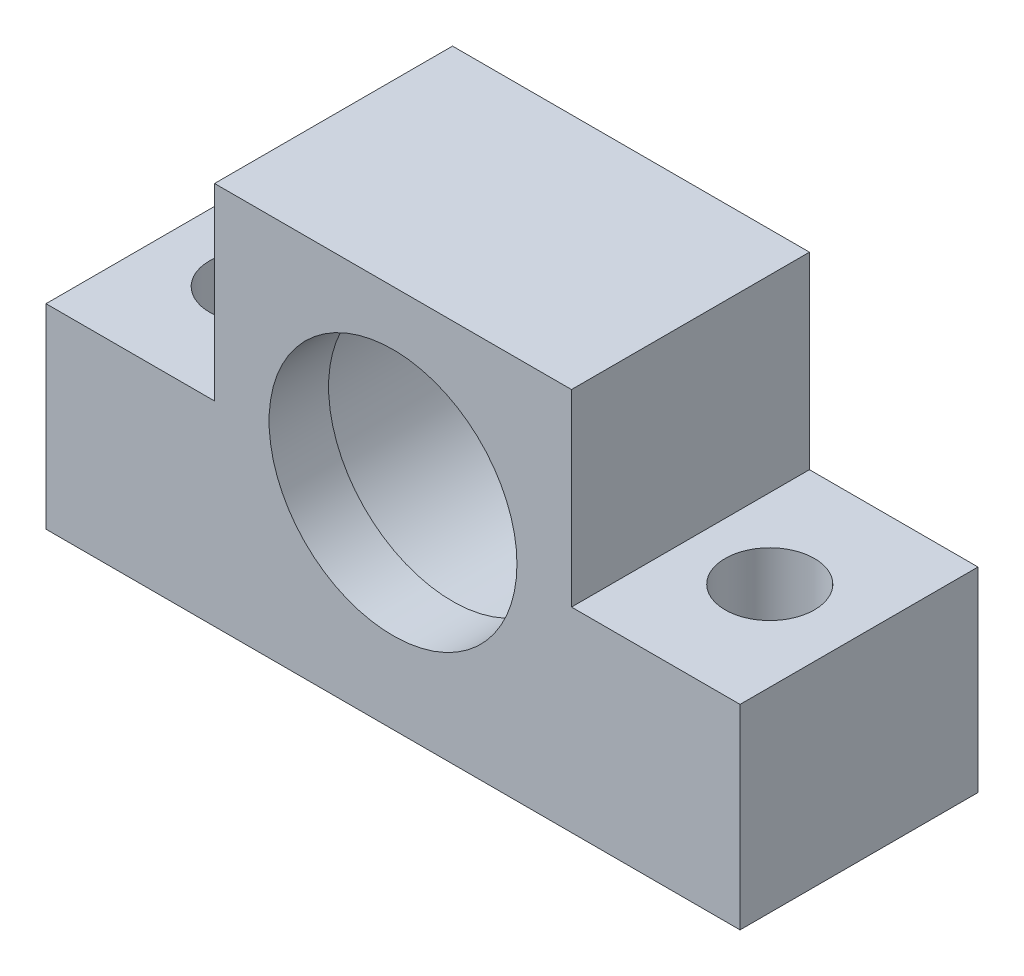
ISO-10303-21;
HEADER;
FILE_DESCRIPTION(('STEP AP214'),'2;1');
FILE_NAME('part.step','',(''),(''),'','','');
FILE_SCHEMA(('AUTOMOTIVE_DESIGN { 1 0 10303 214 1 1 1 1 }'));
ENDSEC;
DATA;
#1=APPLICATION_CONTEXT('core data for automotive mechanical design processes');
#2=APPLICATION_PROTOCOL_DEFINITION('international standard','automotive_design',2000,#1);
#3=PRODUCT_CONTEXT('',#1,'mechanical');
#4=PRODUCT('Part','Part','',(#3));
#5=PRODUCT_RELATED_PRODUCT_CATEGORY('part','',(#4));
#6=PRODUCT_DEFINITION_FORMATION('','',#4);
#7=PRODUCT_DEFINITION_CONTEXT('part definition',#1,'design');
#8=PRODUCT_DEFINITION('design','',#6,#7);
#9=PRODUCT_DEFINITION_SHAPE('','',#8);
#10=(LENGTH_UNIT() NAMED_UNIT(*) SI_UNIT(.MILLI.,.METRE.));
#11=(NAMED_UNIT(*) PLANE_ANGLE_UNIT() SI_UNIT($,.RADIAN.));
#12=(NAMED_UNIT(*) SI_UNIT($,.STERADIAN.) SOLID_ANGLE_UNIT());
#13=UNCERTAINTY_MEASURE_WITH_UNIT(LENGTH_MEASURE(1.E-05),#10,'distance_accuracy_value','');
#14=(GEOMETRIC_REPRESENTATION_CONTEXT(3) GLOBAL_UNCERTAINTY_ASSIGNED_CONTEXT((#13)) GLOBAL_UNIT_ASSIGNED_CONTEXT((#10,
#11,#12)) REPRESENTATION_CONTEXT('',''));
#15=CARTESIAN_POINT('',(0.,0.,0.));
#16=DIRECTION('',(0.,0.,1.));
#17=DIRECTION('',(1.,0.,0.));
#18=AXIS2_PLACEMENT_3D('',#15,#16,#17);
#19=CARTESIAN_POINT('',(0.,0.,0.));
#20=DIRECTION('',(0.,0.,-1.));
#21=DIRECTION('',(-1.,0.,0.));
#22=AXIS2_PLACEMENT_3D('',#19,#20,#21);
#23=PLANE('',#22);
#24=CARTESIAN_POINT('',(-14.1421356237309,34.842135623731,0.));
#25=DIRECTION('',(0.,0.,-1.));
#26=DIRECTION('',(-1.,0.,0.));
#27=AXIS2_PLACEMENT_3D('',#24,#25,#26);
#28=CIRCLE('',#27,1.25);
#29=CARTESIAN_POINT('',(-15.3921356237309,34.842135623731,0.));
#30=VERTEX_POINT('',#29);
#31=EDGE_CURVE('E132',#30,#30,#28,.T.);
#32=ORIENTED_EDGE('',*,*,#31,.F.);
#33=EDGE_LOOP('',(#32));
#34=FACE_BOUND('',#33,.T.);
#35=CARTESIAN_POINT('',(-14.1421356237313,6.55786437626902,0.));
#36=DIRECTION('',(0.,0.,-1.));
#37=DIRECTION('',(-1.,0.,0.));
#38=AXIS2_PLACEMENT_3D('',#35,#36,#37);
#39=CIRCLE('',#38,1.25);
#40=CARTESIAN_POINT('',(-15.3921356237313,6.55786437626902,0.));
#41=VERTEX_POINT('',#40);
#42=EDGE_CURVE('E131',#41,#41,#39,.T.);
#43=ORIENTED_EDGE('',*,*,#42,.F.);
#44=EDGE_LOOP('',(#43));
#45=FACE_BOUND('',#44,.T.);
#46=CARTESIAN_POINT('',(14.1421356237306,6.55786437626872,0.));
#47=DIRECTION('',(0.,0.,-1.));
#48=DIRECTION('',(-1.,0.,0.));
#49=AXIS2_PLACEMENT_3D('',#46,#47,#48);
#50=CIRCLE('',#49,1.25);
#51=CARTESIAN_POINT('',(12.8921356237306,6.55786437626872,0.));
#52=VERTEX_POINT('',#51);
#53=EDGE_CURVE('E142',#52,#52,#50,.T.);
#54=ORIENTED_EDGE('',*,*,#53,.F.);
#55=EDGE_LOOP('',(#54));
#56=FACE_BOUND('',#55,.T.);
#57=CARTESIAN_POINT('',(14.1421356237308,34.8421356237307,0.));
#58=DIRECTION('',(0.,0.,-1.));
#59=DIRECTION('',(-1.,0.,0.));
#60=AXIS2_PLACEMENT_3D('',#57,#58,#59);
#61=CIRCLE('',#60,1.25);
#62=CARTESIAN_POINT('',(12.8921356237308,34.8421356237307,0.));
#63=VERTEX_POINT('',#62);
#64=EDGE_CURVE('E148',#63,#63,#61,.T.);
#65=ORIENTED_EDGE('',*,*,#64,.F.);
#66=EDGE_LOOP('',(#65));
#67=FACE_BOUND('',#66,.T.);
#68=DIRECTION('',(-1.,0.,0.));
#69=VECTOR('',#68,1.);
#70=CARTESIAN_POINT('',(35.,19.7,0.));
#71=LINE('',#70,#69);
#72=CARTESIAN_POINT('',(35.,19.7,0.));
#73=VERTEX_POINT('',#72);
#74=CARTESIAN_POINT('',(18.,19.7,0.));
#75=VERTEX_POINT('',#74);
#76=EDGE_CURVE('E202',#73,#75,#71,.T.);
#77=ORIENTED_EDGE('',*,*,#76,.F.);
#78=DIRECTION('',(0.,1.,0.));
#79=VECTOR('',#78,1.);
#80=CARTESIAN_POINT('',(35.,0.,0.));
#81=LINE('',#80,#79);
#82=CARTESIAN_POINT('',(35.,0.,0.));
#83=VERTEX_POINT('',#82);
#84=EDGE_CURVE('E60',#83,#73,#81,.T.);
#85=ORIENTED_EDGE('',*,*,#84,.F.);
#86=DIRECTION('',(1.,0.,0.));
#87=VECTOR('',#86,1.);
#88=CARTESIAN_POINT('',(-35.,0.,0.));
#89=LINE('',#88,#87);
#90=CARTESIAN_POINT('',(-35.,0.,0.));
#91=VERTEX_POINT('',#90);
#92=EDGE_CURVE('E68',#91,#83,#89,.T.);
#93=ORIENTED_EDGE('',*,*,#92,.F.);
#94=DIRECTION('',(0.,-1.,0.));
#95=VECTOR('',#94,1.);
#96=CARTESIAN_POINT('',(-35.,19.7,0.));
#97=LINE('',#96,#95);
#98=CARTESIAN_POINT('',(-35.,19.7,0.));
#99=VERTEX_POINT('',#98);
#100=EDGE_CURVE('E213',#99,#91,#97,.T.);
#101=ORIENTED_EDGE('',*,*,#100,.F.);
#102=DIRECTION('',(-1.,0.,0.));
#103=VECTOR('',#102,1.);
#104=CARTESIAN_POINT('',(-18.,19.7,0.));
#105=LINE('',#104,#103);
#106=CARTESIAN_POINT('',(-18.,19.7,0.));
#107=VERTEX_POINT('',#106);
#108=EDGE_CURVE('E211',#107,#99,#105,.T.);
#109=ORIENTED_EDGE('',*,*,#108,.F.);
#110=DIRECTION('',(0.,-1.,0.));
#111=VECTOR('',#110,1.);
#112=CARTESIAN_POINT('',(-18.,38.7,0.));
#113=LINE('',#112,#111);
#114=CARTESIAN_POINT('',(-18.,38.7,0.));
#115=VERTEX_POINT('',#114);
#116=EDGE_CURVE('E209',#115,#107,#113,.T.);
#117=ORIENTED_EDGE('',*,*,#116,.F.);
#118=DIRECTION('',(-1.,0.,0.));
#119=VECTOR('',#118,1.);
#120=CARTESIAN_POINT('',(18.,38.7,0.));
#121=LINE('',#120,#119);
#122=CARTESIAN_POINT('',(18.,38.7,0.));
#123=VERTEX_POINT('',#122);
#124=EDGE_CURVE('E207',#123,#115,#121,.T.);
#125=ORIENTED_EDGE('',*,*,#124,.F.);
#126=DIRECTION('',(0.,1.,0.));
#127=VECTOR('',#126,1.);
#128=CARTESIAN_POINT('',(18.,19.7,0.));
#129=LINE('',#128,#127);
#130=EDGE_CURVE('E205',#75,#123,#129,.T.);
#131=ORIENTED_EDGE('',*,*,#130,.F.);
#132=EDGE_LOOP('',(#77,#85,#93,#101,#109,#117,#125,#131));
#133=FACE_BOUND('',#132,.T.);
#134=CARTESIAN_POINT('',(0.,20.7,0.));
#135=DIRECTION('',(0.,0.,1.));
#136=DIRECTION('',(1.,0.,0.));
#137=AXIS2_PLACEMENT_3D('',#134,#135,#136);
#138=CIRCLE('',#137,14.);
#139=CARTESIAN_POINT('',(14.,20.7,0.));
#140=VERTEX_POINT('',#139);
#141=EDGE_CURVE('E199',#140,#140,#138,.T.);
#142=ORIENTED_EDGE('',*,*,#141,.T.);
#143=EDGE_LOOP('',(#142));
#144=FACE_BOUND('',#143,.T.);
#145=ADVANCED_FACE('F45',(#34,#45,#56,#67,#133,#144),#23,.T.);
#146=CARTESIAN_POINT('',(35.,19.7,18.));
#147=DIRECTION('',(0.,-1.,0.));
#148=DIRECTION('',(1.,0.,0.));
#149=AXIS2_PLACEMENT_3D('',#146,#147,#148);
#150=PLANE('',#149);
#151=CARTESIAN_POINT('',(26.,19.7,12.));
#152=DIRECTION('',(0.,1.,0.));
#153=DIRECTION('',(1.,0.,0.));
#154=AXIS2_PLACEMENT_3D('',#151,#152,#153);
#155=CIRCLE('',#154,4.5);
#156=CARTESIAN_POINT('',(30.5,19.7,12.));
#157=VERTEX_POINT('',#156);
#158=EDGE_CURVE('E162',#157,#157,#155,.T.);
#159=ORIENTED_EDGE('',*,*,#158,.F.);
#160=EDGE_LOOP('',(#159));
#161=FACE_BOUND('',#160,.T.);
#162=ORIENTED_EDGE('',*,*,#76,.T.);
#163=DIRECTION('',(0.,0.,-1.));
#164=VECTOR('',#163,1.);
#165=CARTESIAN_POINT('',(18.,19.7,18.));
#166=LINE('',#165,#164);
#167=CARTESIAN_POINT('',(18.,19.7,24.));
#168=VERTEX_POINT('',#167);
#169=EDGE_CURVE('E11',#168,#75,#166,.T.);
#170=ORIENTED_EDGE('',*,*,#169,.F.);
#171=DIRECTION('',(-1.,0.,0.));
#172=VECTOR('',#171,1.);
#173=CARTESIAN_POINT('',(0.,19.7,24.));
#174=LINE('',#173,#172);
#175=CARTESIAN_POINT('',(35.,19.7,24.));
#176=VERTEX_POINT('',#175);
#177=EDGE_CURVE('E170',#176,#168,#174,.T.);
#178=ORIENTED_EDGE('',*,*,#177,.F.);
#179=DIRECTION('',(0.,0.,-1.));
#180=VECTOR('',#179,1.);
#181=CARTESIAN_POINT('',(35.,19.7,18.));
#182=LINE('',#181,#180);
#183=EDGE_CURVE('E217',#176,#73,#182,.T.);
#184=ORIENTED_EDGE('',*,*,#183,.T.);
#185=EDGE_LOOP('',(#162,#170,#178,#184));
#186=FACE_BOUND('',#185,.T.);
#187=ADVANCED_FACE('F47',(#161,#186),#150,.F.);
#188=CARTESIAN_POINT('',(18.,19.7,18.));
#189=DIRECTION('',(-1.,0.,0.));
#190=DIRECTION('',(0.,-1.,0.));
#191=AXIS2_PLACEMENT_3D('',#188,#189,#190);
#192=PLANE('',#191);
#193=ORIENTED_EDGE('',*,*,#130,.T.);
#194=DIRECTION('',(0.,0.,-1.));
#195=VECTOR('',#194,1.);
#196=CARTESIAN_POINT('',(18.,38.7,18.));
#197=LINE('',#196,#195);
#198=CARTESIAN_POINT('',(18.,38.7,24.));
#199=VERTEX_POINT('',#198);
#200=EDGE_CURVE('E53',#199,#123,#197,.T.);
#201=ORIENTED_EDGE('',*,*,#200,.F.);
#202=DIRECTION('',(0.,1.,0.));
#203=VECTOR('',#202,1.);
#204=CARTESIAN_POINT('',(18.,0.,24.));
#205=LINE('',#204,#203);
#206=EDGE_CURVE('E173',#168,#199,#205,.T.);
#207=ORIENTED_EDGE('',*,*,#206,.F.);
#208=ORIENTED_EDGE('',*,*,#169,.T.);
#209=EDGE_LOOP('',(#193,#201,#207,#208));
#210=FACE_BOUND('',#209,.T.);
#211=ADVANCED_FACE('F262',(#210),#192,.F.);
#212=CARTESIAN_POINT('',(18.,38.7,18.));
#213=DIRECTION('',(0.,-1.,0.));
#214=DIRECTION('',(0.,0.,-1.));
#215=AXIS2_PLACEMENT_3D('',#212,#213,#214);
#216=PLANE('',#215);
#217=ORIENTED_EDGE('',*,*,#124,.T.);
#218=DIRECTION('',(0.,0.,-1.));
#219=VECTOR('',#218,1.);
#220=CARTESIAN_POINT('',(-18.,38.7,18.));
#221=LINE('',#220,#219);
#222=CARTESIAN_POINT('',(-18.,38.7,24.));
#223=VERTEX_POINT('',#222);
#224=EDGE_CURVE('E229',#223,#115,#221,.T.);
#225=ORIENTED_EDGE('',*,*,#224,.F.);
#226=DIRECTION('',(-1.,0.,0.));
#227=VECTOR('',#226,1.);
#228=CARTESIAN_POINT('',(0.,38.7,24.));
#229=LINE('',#228,#227);
#230=EDGE_CURVE('E176',#199,#223,#229,.T.);
#231=ORIENTED_EDGE('',*,*,#230,.F.);
#232=ORIENTED_EDGE('',*,*,#200,.T.);
#233=EDGE_LOOP('',(#217,#225,#231,#232));
#234=FACE_BOUND('',#233,.T.);
#235=ADVANCED_FACE('F235',(#234),#216,.F.);
#236=CARTESIAN_POINT('',(-18.,38.7,18.));
#237=DIRECTION('',(1.,0.,0.));
#238=DIRECTION('',(0.,1.,0.));
#239=AXIS2_PLACEMENT_3D('',#236,#237,#238);
#240=PLANE('',#239);
#241=ORIENTED_EDGE('',*,*,#116,.T.);
#242=DIRECTION('',(0.,0.,-1.));
#243=VECTOR('',#242,1.);
#244=CARTESIAN_POINT('',(-18.,19.7,18.));
#245=LINE('',#244,#243);
#246=CARTESIAN_POINT('',(-18.,19.7,24.));
#247=VERTEX_POINT('',#246);
#248=EDGE_CURVE('E226',#247,#107,#245,.T.);
#249=ORIENTED_EDGE('',*,*,#248,.F.);
#250=DIRECTION('',(0.,-1.,0.));
#251=VECTOR('',#250,1.);
#252=CARTESIAN_POINT('',(-18.,0.,24.));
#253=LINE('',#252,#251);
#254=EDGE_CURVE('E179',#223,#247,#253,.T.);
#255=ORIENTED_EDGE('',*,*,#254,.F.);
#256=ORIENTED_EDGE('',*,*,#224,.T.);
#257=EDGE_LOOP('',(#241,#249,#255,#256));
#258=FACE_BOUND('',#257,.T.);
#259=ADVANCED_FACE('F245',(#258),#240,.F.);
#260=CARTESIAN_POINT('',(-18.,19.7,18.));
#261=DIRECTION('',(0.,-1.,0.));
#262=DIRECTION('',(1.,0.,0.));
#263=AXIS2_PLACEMENT_3D('',#260,#261,#262);
#264=PLANE('',#263);
#265=CARTESIAN_POINT('',(-26.,19.7,12.));
#266=DIRECTION('',(0.,1.,0.));
#267=DIRECTION('',(-1.,0.,0.));
#268=AXIS2_PLACEMENT_3D('',#265,#266,#267);
#269=CIRCLE('',#268,4.5);
#270=CARTESIAN_POINT('',(-30.5,19.7,12.));
#271=VERTEX_POINT('',#270);
#272=EDGE_CURVE('E159',#271,#271,#269,.T.);
#273=ORIENTED_EDGE('',*,*,#272,.F.);
#274=EDGE_LOOP('',(#273));
#275=FACE_BOUND('',#274,.T.);
#276=ORIENTED_EDGE('',*,*,#108,.T.);
#277=DIRECTION('',(0.,0.,-1.));
#278=VECTOR('',#277,1.);
#279=CARTESIAN_POINT('',(-35.,19.7,18.));
#280=LINE('',#279,#278);
#281=CARTESIAN_POINT('',(-35.,19.7,24.));
#282=VERTEX_POINT('',#281);
#283=EDGE_CURVE('E223',#282,#99,#280,.T.);
#284=ORIENTED_EDGE('',*,*,#283,.F.);
#285=DIRECTION('',(-1.,0.,0.));
#286=VECTOR('',#285,1.);
#287=CARTESIAN_POINT('',(0.,19.7,24.));
#288=LINE('',#287,#286);
#289=EDGE_CURVE('E182',#247,#282,#288,.T.);
#290=ORIENTED_EDGE('',*,*,#289,.F.);
#291=ORIENTED_EDGE('',*,*,#248,.T.);
#292=EDGE_LOOP('',(#276,#284,#290,#291));
#293=FACE_BOUND('',#292,.T.);
#294=ADVANCED_FACE('F249',(#275,#293),#264,.F.);
#295=CARTESIAN_POINT('',(-35.,19.7,18.));
#296=DIRECTION('',(1.,0.,0.));
#297=DIRECTION('',(0.,0.,-1.));
#298=AXIS2_PLACEMENT_3D('',#295,#296,#297);
#299=PLANE('',#298);
#300=ORIENTED_EDGE('',*,*,#100,.T.);
#301=DIRECTION('',(0.,0.,-1.));
#302=VECTOR('',#301,1.);
#303=CARTESIAN_POINT('',(-35.,0.,18.));
#304=LINE('',#303,#302);
#305=CARTESIAN_POINT('',(-35.,0.,24.));
#306=VERTEX_POINT('',#305);
#307=EDGE_CURVE('E221',#306,#91,#304,.T.);
#308=ORIENTED_EDGE('',*,*,#307,.F.);
#309=DIRECTION('',(0.,-1.,0.));
#310=VECTOR('',#309,1.);
#311=CARTESIAN_POINT('',(-35.,0.,24.));
#312=LINE('',#311,#310);
#313=EDGE_CURVE('E185',#282,#306,#312,.T.);
#314=ORIENTED_EDGE('',*,*,#313,.F.);
#315=ORIENTED_EDGE('',*,*,#283,.T.);
#316=EDGE_LOOP('',(#300,#308,#314,#315));
#317=FACE_BOUND('',#316,.T.);
#318=ADVANCED_FACE('F256',(#317),#299,.F.);
#319=CARTESIAN_POINT('',(-35.,0.,18.));
#320=DIRECTION('',(0.,1.,0.));
#321=DIRECTION('',(0.,0.,1.));
#322=AXIS2_PLACEMENT_3D('',#319,#320,#321);
#323=PLANE('',#322);
#324=CARTESIAN_POINT('',(-26.,0.,12.));
#325=DIRECTION('',(0.,1.,0.));
#326=DIRECTION('',(-1.,0.,0.));
#327=AXIS2_PLACEMENT_3D('',#324,#325,#326);
#328=CIRCLE('',#327,4.5);
#329=CARTESIAN_POINT('',(-30.5,0.,12.));
#330=VERTEX_POINT('',#329);
#331=EDGE_CURVE('E155',#330,#330,#328,.T.);
#332=ORIENTED_EDGE('',*,*,#331,.T.);
#333=EDGE_LOOP('',(#332));
#334=FACE_BOUND('',#333,.T.);
#335=CARTESIAN_POINT('',(26.,0.,12.));
#336=DIRECTION('',(0.,1.,0.));
#337=DIRECTION('',(1.,0.,0.));
#338=AXIS2_PLACEMENT_3D('',#335,#336,#337);
#339=CIRCLE('',#338,4.5);
#340=CARTESIAN_POINT('',(30.5,0.,12.));
#341=VERTEX_POINT('',#340);
#342=EDGE_CURVE('E154',#341,#341,#339,.T.);
#343=ORIENTED_EDGE('',*,*,#342,.T.);
#344=EDGE_LOOP('',(#343));
#345=FACE_BOUND('',#344,.T.);
#346=ORIENTED_EDGE('',*,*,#92,.T.);
#347=DIRECTION('',(0.,0.,-1.));
#348=VECTOR('',#347,1.);
#349=CARTESIAN_POINT('',(35.,0.,18.));
#350=LINE('',#349,#348);
#351=CARTESIAN_POINT('',(35.,0.,24.));
#352=VERTEX_POINT('',#351);
#353=EDGE_CURVE('E219',#352,#83,#350,.T.);
#354=ORIENTED_EDGE('',*,*,#353,.F.);
#355=DIRECTION('',(1.,0.,0.));
#356=VECTOR('',#355,1.);
#357=CARTESIAN_POINT('',(0.,0.,24.));
#358=LINE('',#357,#356);
#359=EDGE_CURVE('E188',#306,#352,#358,.T.);
#360=ORIENTED_EDGE('',*,*,#359,.F.);
#361=ORIENTED_EDGE('',*,*,#307,.T.);
#362=EDGE_LOOP('',(#346,#354,#360,#361));
#363=FACE_BOUND('',#362,.T.);
#364=ADVANCED_FACE('F257',(#334,#345,#363),#323,.F.);
#365=CARTESIAN_POINT('',(35.,0.,18.));
#366=DIRECTION('',(-1.,0.,0.));
#367=DIRECTION('',(0.,0.,1.));
#368=AXIS2_PLACEMENT_3D('',#365,#366,#367);
#369=PLANE('',#368);
#370=ORIENTED_EDGE('',*,*,#84,.T.);
#371=ORIENTED_EDGE('',*,*,#183,.F.);
#372=DIRECTION('',(0.,1.,0.));
#373=VECTOR('',#372,1.);
#374=CARTESIAN_POINT('',(35.,0.,24.));
#375=LINE('',#374,#373);
#376=EDGE_CURVE('E167',#352,#176,#375,.T.);
#377=ORIENTED_EDGE('',*,*,#376,.F.);
#378=ORIENTED_EDGE('',*,*,#353,.T.);
#379=EDGE_LOOP('',(#370,#371,#377,#378));
#380=FACE_BOUND('',#379,.T.);
#381=ADVANCED_FACE('F261',(#380),#369,.F.);
#382=CARTESIAN_POINT('',(0.,20.7,18.));
#383=DIRECTION('',(0.,0.,-1.));
#384=DIRECTION('',(-1.,0.,0.));
#385=AXIS2_PLACEMENT_3D('',#382,#383,#384);
#386=CYLINDRICAL_SURFACE('',#385,14.);
#387=CARTESIAN_POINT('',(0.,20.7,18.));
#388=DIRECTION('',(0.,0.,1.));
#389=DIRECTION('',(1.,0.,0.));
#390=AXIS2_PLACEMENT_3D('',#387,#388,#389);
#391=CIRCLE('',#390,14.);
#392=CARTESIAN_POINT('',(14.,20.7,18.));
#393=VERTEX_POINT('',#392);
#394=EDGE_CURVE('E194',#393,#393,#391,.T.);
#395=ORIENTED_EDGE('',*,*,#394,.T.);
#396=EDGE_LOOP('',(#395));
#397=FACE_BOUND('',#396,.T.);
#398=ORIENTED_EDGE('',*,*,#141,.F.);
#399=EDGE_LOOP('',(#398));
#400=FACE_BOUND('',#399,.T.);
#401=ADVANCED_FACE('F279',(#397,#400),#386,.F.);
#402=CARTESIAN_POINT('',(0.,0.,18.));
#403=DIRECTION('',(0.,0.,1.));
#404=DIRECTION('',(1.,0.,0.));
#405=AXIS2_PLACEMENT_3D('',#402,#403,#404);
#406=PLANE('',#405);
#407=CARTESIAN_POINT('',(0.,20.7,18.));
#408=DIRECTION('',(0.,0.,1.));
#409=DIRECTION('',(1.,0.,0.));
#410=AXIS2_PLACEMENT_3D('',#407,#408,#409);
#411=CIRCLE('',#410,12.5);
#412=CARTESIAN_POINT('',(12.5,20.7,18.));
#413=VERTEX_POINT('',#412);
#414=EDGE_CURVE('E158',#413,#413,#411,.T.);
#415=ORIENTED_EDGE('',*,*,#414,.T.);
#416=EDGE_LOOP('',(#415));
#417=FACE_BOUND('',#416,.T.);
#418=ORIENTED_EDGE('',*,*,#394,.F.);
#419=EDGE_LOOP('',(#418));
#420=FACE_BOUND('',#419,.T.);
#421=ADVANCED_FACE('F321',(#417,#420),#406,.F.);
#422=CARTESIAN_POINT('',(0.,20.7,24.));
#423=DIRECTION('',(0.,0.,-1.));
#424=DIRECTION('',(-1.,0.,0.));
#425=AXIS2_PLACEMENT_3D('',#422,#423,#424);
#426=CYLINDRICAL_SURFACE('',#425,12.5);
#427=CARTESIAN_POINT('',(0.,20.7,24.));
#428=DIRECTION('',(0.,0.,1.));
#429=DIRECTION('',(1.,0.,0.));
#430=AXIS2_PLACEMENT_3D('',#427,#428,#429);
#431=CIRCLE('',#430,12.5);
#432=CARTESIAN_POINT('',(12.5,20.7,24.));
#433=VERTEX_POINT('',#432);
#434=EDGE_CURVE('E191',#433,#433,#431,.T.);
#435=ORIENTED_EDGE('',*,*,#434,.T.);
#436=EDGE_LOOP('',(#435));
#437=FACE_BOUND('',#436,.T.);
#438=ORIENTED_EDGE('',*,*,#414,.F.);
#439=EDGE_LOOP('',(#438));
#440=FACE_BOUND('',#439,.T.);
#441=ADVANCED_FACE('F327',(#437,#440),#426,.F.);
#442=CARTESIAN_POINT('',(0.,0.,24.));
#443=DIRECTION('',(0.,0.,1.));
#444=DIRECTION('',(1.,0.,0.));
#445=AXIS2_PLACEMENT_3D('',#442,#443,#444);
#446=PLANE('',#445);
#447=ORIENTED_EDGE('',*,*,#376,.T.);
#448=ORIENTED_EDGE('',*,*,#177,.T.);
#449=ORIENTED_EDGE('',*,*,#206,.T.);
#450=ORIENTED_EDGE('',*,*,#230,.T.);
#451=ORIENTED_EDGE('',*,*,#254,.T.);
#452=ORIENTED_EDGE('',*,*,#289,.T.);
#453=ORIENTED_EDGE('',*,*,#313,.T.);
#454=ORIENTED_EDGE('',*,*,#359,.T.);
#455=EDGE_LOOP('',(#447,#448,#449,#450,#451,#452,#453,#454));
#456=FACE_BOUND('',#455,.T.);
#457=ORIENTED_EDGE('',*,*,#434,.F.);
#458=EDGE_LOOP('',(#457));
#459=FACE_BOUND('',#458,.T.);
#460=ADVANCED_FACE('F252',(#456,#459),#446,.T.);
#461=CARTESIAN_POINT('',(26.,0.,12.));
#462=DIRECTION('',(0.,1.,0.));
#463=DIRECTION('',(-1.,0.,0.));
#464=AXIS2_PLACEMENT_3D('',#461,#462,#463);
#465=CYLINDRICAL_SURFACE('',#464,4.5);
#466=ORIENTED_EDGE('',*,*,#342,.F.);
#467=EDGE_LOOP('',(#466));
#468=FACE_BOUND('',#467,.T.);
#469=ORIENTED_EDGE('',*,*,#158,.T.);
#470=EDGE_LOOP('',(#469));
#471=FACE_BOUND('',#470,.T.);
#472=ADVANCED_FACE('F341',(#468,#471),#465,.F.);
#473=CARTESIAN_POINT('',(-26.,0.,12.));
#474=DIRECTION('',(0.,1.,0.));
#475=DIRECTION('',(-1.,0.,0.));
#476=AXIS2_PLACEMENT_3D('',#473,#474,#475);
#477=CYLINDRICAL_SURFACE('',#476,4.5);
#478=ORIENTED_EDGE('',*,*,#331,.F.);
#479=EDGE_LOOP('',(#478));
#480=FACE_BOUND('',#479,.T.);
#481=ORIENTED_EDGE('',*,*,#272,.T.);
#482=EDGE_LOOP('',(#481));
#483=FACE_BOUND('',#482,.T.);
#484=ADVANCED_FACE('F347',(#480,#483),#477,.F.);
#485=CARTESIAN_POINT('',(14.1421356237308,34.8421356237307,7.5));
#486=DIRECTION('',(0.,0.,-1.));
#487=DIRECTION('',(-1.,0.,0.));
#488=AXIS2_PLACEMENT_3D('',#485,#486,#487);
#489=CONICAL_SURFACE('',#488,1.25,1.02974425867665);
#490=CARTESIAN_POINT('',(14.1421356237308,34.8421356237307,8.25107577378445));
#491=VERTEX_POINT('',#490);
#492=VERTEX_LOOP('',#491);
#493=FACE_BOUND('',#492,.T.);
#494=CARTESIAN_POINT('',(14.1421356237308,34.8421356237307,7.5));
#495=DIRECTION('',(0.,0.,-1.));
#496=DIRECTION('',(-1.,0.,0.));
#497=AXIS2_PLACEMENT_3D('',#494,#495,#496);
#498=CIRCLE('',#497,1.25);
#499=CARTESIAN_POINT('',(12.8921356237308,34.8421356237307,7.5));
#500=VERTEX_POINT('',#499);
#501=EDGE_CURVE('E151',#500,#500,#498,.T.);
#502=ORIENTED_EDGE('',*,*,#501,.T.);
#503=EDGE_LOOP('',(#502));
#504=FACE_BOUND('',#503,.T.);
#505=ADVANCED_FACE('F355',(#493,#504),#489,.F.);
#506=CARTESIAN_POINT('',(14.1421356237308,34.8421356237307,0.));
#507=DIRECTION('',(0.,0.,-1.));
#508=DIRECTION('',(-1.,0.,0.));
#509=AXIS2_PLACEMENT_3D('',#506,#507,#508);
#510=CYLINDRICAL_SURFACE('',#509,1.25);
#511=ORIENTED_EDGE('',*,*,#501,.F.);
#512=EDGE_LOOP('',(#511));
#513=FACE_BOUND('',#512,.T.);
#514=ORIENTED_EDGE('',*,*,#64,.T.);
#515=EDGE_LOOP('',(#514));
#516=FACE_BOUND('',#515,.T.);
#517=ADVANCED_FACE('F364',(#513,#516),#510,.F.);
#518=CARTESIAN_POINT('',(14.1421356237306,6.55786437626872,7.5));
#519=DIRECTION('',(0.,0.,-1.));
#520=DIRECTION('',(-1.,0.,0.));
#521=AXIS2_PLACEMENT_3D('',#518,#519,#520);
#522=CONICAL_SURFACE('',#521,1.25,1.02974425867665);
#523=CARTESIAN_POINT('',(14.1421356237306,6.55786437626872,8.25107577378445));
#524=VERTEX_POINT('',#523);
#525=VERTEX_LOOP('',#524);
#526=FACE_BOUND('',#525,.T.);
#527=CARTESIAN_POINT('',(14.1421356237306,6.55786437626872,7.5));
#528=DIRECTION('',(0.,0.,-1.));
#529=DIRECTION('',(-1.,0.,0.));
#530=AXIS2_PLACEMENT_3D('',#527,#528,#529);
#531=CIRCLE('',#530,1.25);
#532=CARTESIAN_POINT('',(12.8921356237306,6.55786437626872,7.5));
#533=VERTEX_POINT('',#532);
#534=EDGE_CURVE('E145',#533,#533,#531,.T.);
#535=ORIENTED_EDGE('',*,*,#534,.T.);
#536=EDGE_LOOP('',(#535));
#537=FACE_BOUND('',#536,.T.);
#538=ADVANCED_FACE('F373',(#526,#537),#522,.F.);
#539=CARTESIAN_POINT('',(14.1421356237306,6.55786437626872,0.));
#540=DIRECTION('',(0.,0.,-1.));
#541=DIRECTION('',(-1.,0.,0.));
#542=AXIS2_PLACEMENT_3D('',#539,#540,#541);
#543=CYLINDRICAL_SURFACE('',#542,1.25);
#544=ORIENTED_EDGE('',*,*,#534,.F.);
#545=EDGE_LOOP('',(#544));
#546=FACE_BOUND('',#545,.T.);
#547=ORIENTED_EDGE('',*,*,#53,.T.);
#548=EDGE_LOOP('',(#547));
#549=FACE_BOUND('',#548,.T.);
#550=ADVANCED_FACE('F383',(#546,#549),#543,.F.);
#551=CARTESIAN_POINT('',(-14.1421356237313,6.55786437626902,7.5));
#552=DIRECTION('',(0.,0.,-1.));
#553=DIRECTION('',(-1.,0.,0.));
#554=AXIS2_PLACEMENT_3D('',#551,#552,#553);
#555=CONICAL_SURFACE('',#554,1.25,1.02974425867665);
#556=CARTESIAN_POINT('',(-14.1421356237313,6.55786437626902,8.25107577378445));
#557=VERTEX_POINT('',#556);
#558=VERTEX_LOOP('',#557);
#559=FACE_BOUND('',#558,.T.);
#560=CARTESIAN_POINT('',(-14.1421356237313,6.55786437626902,7.5));
#561=DIRECTION('',(0.,0.,-1.));
#562=DIRECTION('',(-1.,0.,0.));
#563=AXIS2_PLACEMENT_3D('',#560,#561,#562);
#564=CIRCLE('',#563,1.25);
#565=CARTESIAN_POINT('',(-15.3921356237313,6.55786437626902,7.5));
#566=VERTEX_POINT('',#565);
#567=EDGE_CURVE('E135',#566,#566,#564,.T.);
#568=ORIENTED_EDGE('',*,*,#567,.T.);
#569=EDGE_LOOP('',(#568));
#570=FACE_BOUND('',#569,.T.);
#571=ADVANCED_FACE('F392',(#559,#570),#555,.F.);
#572=CARTESIAN_POINT('',(-14.1421356237313,6.55786437626902,0.));
#573=DIRECTION('',(0.,0.,-1.));
#574=DIRECTION('',(-1.,0.,0.));
#575=AXIS2_PLACEMENT_3D('',#572,#573,#574);
#576=CYLINDRICAL_SURFACE('',#575,1.25);
#577=ORIENTED_EDGE('',*,*,#567,.F.);
#578=EDGE_LOOP('',(#577));
#579=FACE_BOUND('',#578,.T.);
#580=ORIENTED_EDGE('',*,*,#42,.T.);
#581=EDGE_LOOP('',(#580));
#582=FACE_BOUND('',#581,.T.);
#583=ADVANCED_FACE('F125',(#579,#582),#576,.F.);
#584=CARTESIAN_POINT('',(-14.1421356237309,34.842135623731,7.5));
#585=DIRECTION('',(0.,0.,-1.));
#586=DIRECTION('',(-1.,0.,0.));
#587=AXIS2_PLACEMENT_3D('',#584,#585,#586);
#588=CONICAL_SURFACE('',#587,1.25,1.02974425867665);
#589=CARTESIAN_POINT('',(-14.1421356237309,34.842135623731,8.25107577378445));
#590=VERTEX_POINT('',#589);
#591=VERTEX_LOOP('',#590);
#592=FACE_BOUND('',#591,.T.);
#593=CARTESIAN_POINT('',(-14.1421356237309,34.842135623731,7.5));
#594=DIRECTION('',(0.,0.,-1.));
#595=DIRECTION('',(-1.,0.,0.));
#596=AXIS2_PLACEMENT_3D('',#593,#594,#595);
#597=CIRCLE('',#596,1.25);
#598=CARTESIAN_POINT('',(-15.3921356237309,34.842135623731,7.5));
#599=VERTEX_POINT('',#598);
#600=EDGE_CURVE('E129',#599,#599,#597,.T.);
#601=ORIENTED_EDGE('',*,*,#600,.T.);
#602=EDGE_LOOP('',(#601));
#603=FACE_BOUND('',#602,.T.);
#604=ADVANCED_FACE('F121',(#592,#603),#588,.F.);
#605=CARTESIAN_POINT('',(-14.1421356237309,34.842135623731,0.));
#606=DIRECTION('',(0.,0.,-1.));
#607=DIRECTION('',(-1.,0.,0.));
#608=AXIS2_PLACEMENT_3D('',#605,#606,#607);
#609=CYLINDRICAL_SURFACE('',#608,1.25);
#610=ORIENTED_EDGE('',*,*,#600,.F.);
#611=EDGE_LOOP('',(#610));
#612=FACE_BOUND('',#611,.T.);
#613=ORIENTED_EDGE('',*,*,#31,.T.);
#614=EDGE_LOOP('',(#613));
#615=FACE_BOUND('',#614,.T.);
#616=ADVANCED_FACE('F124',(#612,#615),#609,.F.);
#617=CLOSED_SHELL('',(#145,#187,#211,#235,#259,#294,#318,#364,#381,#401,#421,#441,#460,#472,
#484,#505,#517,#538,#550,#571,#583,#604,#616));
#618=MANIFOLD_SOLID_BREP('B2',#617);
#619=ADVANCED_BREP_SHAPE_REPRESENTATION('',(#18,#618),#14);
#620=SHAPE_DEFINITION_REPRESENTATION(#9,#619);
ENDSEC;
END-ISO-10303-21;
